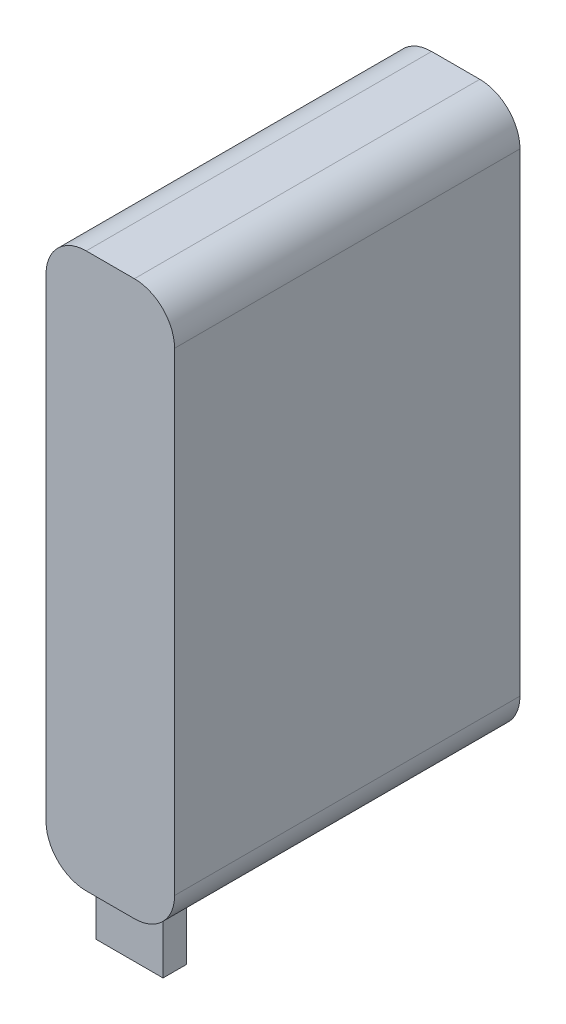
ISO-10303-21;
HEADER;
FILE_DESCRIPTION(('STEP AP214'),'2;1');
FILE_NAME('part.step','',(''),(''),'','','');
FILE_SCHEMA(('AUTOMOTIVE_DESIGN { 1 0 10303 214 1 1 1 1 }'));
ENDSEC;
DATA;
#1=APPLICATION_CONTEXT('core data for automotive mechanical design processes');
#2=APPLICATION_PROTOCOL_DEFINITION('international standard','automotive_design',2000,#1);
#3=PRODUCT_CONTEXT('',#1,'mechanical');
#4=PRODUCT('Part','Part','',(#3));
#5=PRODUCT_RELATED_PRODUCT_CATEGORY('part','',(#4));
#6=PRODUCT_DEFINITION_FORMATION('','',#4);
#7=PRODUCT_DEFINITION_CONTEXT('part definition',#1,'design');
#8=PRODUCT_DEFINITION('design','',#6,#7);
#9=PRODUCT_DEFINITION_SHAPE('','',#8);
#10=(LENGTH_UNIT() NAMED_UNIT(*) SI_UNIT(.MILLI.,.METRE.));
#11=(NAMED_UNIT(*) PLANE_ANGLE_UNIT() SI_UNIT($,.RADIAN.));
#12=(NAMED_UNIT(*) SI_UNIT($,.STERADIAN.) SOLID_ANGLE_UNIT());
#13=UNCERTAINTY_MEASURE_WITH_UNIT(LENGTH_MEASURE(1.E-05),#10,'distance_accuracy_value','');
#14=(GEOMETRIC_REPRESENTATION_CONTEXT(3) GLOBAL_UNCERTAINTY_ASSIGNED_CONTEXT((#13)) GLOBAL_UNIT_ASSIGNED_CONTEXT((#10,
#11,#12)) REPRESENTATION_CONTEXT('',''));
#15=CARTESIAN_POINT('',(0.,0.,0.));
#16=DIRECTION('',(0.,0.,1.));
#17=DIRECTION('',(1.,0.,0.));
#18=AXIS2_PLACEMENT_3D('',#15,#16,#17);
#19=CARTESIAN_POINT('',(-2.99999999999996,-34.5,43.));
#20=DIRECTION('',(0.,1.,0.));
#21=DIRECTION('',(0.,0.,1.));
#22=AXIS2_PLACEMENT_3D('',#19,#20,#21);
#23=PLANE('',#22);
#24=DIRECTION('',(0.,0.,-1.));
#25=VECTOR('',#24,1.);
#26=CARTESIAN_POINT('',(2.99999999999996,-34.5,43.));
#27=LINE('',#26,#25);
#28=CARTESIAN_POINT('',(2.99999999999996,-34.5,37.7090455408714));
#29=VERTEX_POINT('',#28);
#30=CARTESIAN_POINT('',(2.99999999999996,-34.5,0.));
#31=VERTEX_POINT('',#30);
#32=EDGE_CURVE('E168',#29,#31,#27,.T.);
#33=ORIENTED_EDGE('',*,*,#32,.F.);
#34=DIRECTION('',(-1.,0.,0.));
#35=VECTOR('',#34,1.);
#36=CARTESIAN_POINT('',(-2.99999999999996,-34.5,37.7090455408714));
#37=LINE('',#36,#35);
#38=CARTESIAN_POINT('',(-2.99999999999996,-34.5,37.7090455408714));
#39=VERTEX_POINT('',#38);
#40=EDGE_CURVE('E194',#29,#39,#37,.T.);
#41=ORIENTED_EDGE('',*,*,#40,.T.);
#42=DIRECTION('',(0.,0.,-1.));
#43=VECTOR('',#42,1.);
#44=CARTESIAN_POINT('',(-2.99999999999996,-34.5,43.));
#45=LINE('',#44,#43);
#46=CARTESIAN_POINT('',(-2.99999999999996,-34.5,0.));
#47=VERTEX_POINT('',#46);
#48=EDGE_CURVE('E172',#39,#47,#45,.T.);
#49=ORIENTED_EDGE('',*,*,#48,.T.);
#50=DIRECTION('',(1.,0.,0.));
#51=VECTOR('',#50,1.);
#52=CARTESIAN_POINT('',(-2.99999999999996,-34.5,0.));
#53=LINE('',#52,#51);
#54=EDGE_CURVE('E144',#47,#31,#53,.T.);
#55=ORIENTED_EDGE('',*,*,#54,.T.);
#56=EDGE_LOOP('',(#33,#41,#49,#55));
#57=FACE_BOUND('',#56,.T.);
#58=ADVANCED_FACE('F32',(#57),#23,.F.);
#59=CARTESIAN_POINT('',(-2.99999999999999,-29.5,43.));
#60=DIRECTION('',(0.,0.,-1.));
#61=DIRECTION('',(-1.,0.,0.));
#62=AXIS2_PLACEMENT_3D('',#59,#60,#61);
#63=CYLINDRICAL_SURFACE('',#62,5.);
#64=ORIENTED_EDGE('',*,*,#48,.F.);
#65=CARTESIAN_POINT('',(-2.99999999999999,-29.5,37.7090455408714));
#66=DIRECTION('',(0.,0.,-1.));
#67=DIRECTION('',(-1.,0.,0.));
#68=AXIS2_PLACEMENT_3D('',#65,#66,#67);
#69=CIRCLE('',#68,5.);
#70=CARTESIAN_POINT('',(-4.17549652573426,-34.3598567795756,37.7090455408714));
#71=VERTEX_POINT('',#70);
#72=EDGE_CURVE('E145',#39,#71,#69,.T.);
#73=ORIENTED_EDGE('',*,*,#72,.T.);
#74=DIRECTION('',(0.,0.,-1.));
#75=VECTOR('',#74,1.);
#76=CARTESIAN_POINT('',(-4.17549652573426,-34.3598567795756,43.));
#77=LINE('',#76,#75);
#78=CARTESIAN_POINT('',(-4.17549652573426,-34.3598567795756,40.6086959059646));
#79=VERTEX_POINT('',#78);
#80=EDGE_CURVE('E11',#71,#79,#77,.F.);
#81=ORIENTED_EDGE('',*,*,#80,.T.);
#82=CARTESIAN_POINT('',(-2.99999999999999,-29.5,40.6086959059646));
#83=DIRECTION('',(0.,0.,1.));
#84=DIRECTION('',(1.,0.,0.));
#85=AXIS2_PLACEMENT_3D('',#82,#83,#84);
#86=CIRCLE('',#85,5.);
#87=CARTESIAN_POINT('',(-2.99999999999996,-34.5,40.6086959059646));
#88=VERTEX_POINT('',#87);
#89=EDGE_CURVE('E219',#79,#88,#86,.T.);
#90=ORIENTED_EDGE('',*,*,#89,.T.);
#91=CARTESIAN_POINT('',(-2.99999999999996,-34.5,43.));
#92=VERTEX_POINT('',#91);
#93=EDGE_CURVE('E173',#92,#88,#45,.T.);
#94=ORIENTED_EDGE('',*,*,#93,.F.);
#95=CARTESIAN_POINT('',(-2.99999999999999,-29.5,43.));
#96=DIRECTION('',(0.,0.,1.));
#97=DIRECTION('',(1.,0.,0.));
#98=AXIS2_PLACEMENT_3D('',#95,#96,#97);
#99=CIRCLE('',#98,5.);
#100=CARTESIAN_POINT('',(-7.99999999999999,-29.5,43.));
#101=VERTEX_POINT('',#100);
#102=EDGE_CURVE('E158',#101,#92,#99,.T.);
#103=ORIENTED_EDGE('',*,*,#102,.F.);
#104=DIRECTION('',(0.,0.,-1.));
#105=VECTOR('',#104,1.);
#106=CARTESIAN_POINT('',(-7.99999999999999,-29.5,43.));
#107=LINE('',#106,#105);
#108=CARTESIAN_POINT('',(-7.99999999999999,-29.5,0.));
#109=VERTEX_POINT('',#108);
#110=EDGE_CURVE('E137',#101,#109,#107,.T.);
#111=ORIENTED_EDGE('',*,*,#110,.T.);
#112=CARTESIAN_POINT('',(-2.99999999999999,-29.5,0.));
#113=DIRECTION('',(0.,0.,1.));
#114=DIRECTION('',(1.,0.,0.));
#115=AXIS2_PLACEMENT_3D('',#112,#113,#114);
#116=CIRCLE('',#115,5.);
#117=EDGE_CURVE('E141',#109,#47,#116,.T.);
#118=ORIENTED_EDGE('',*,*,#117,.T.);
#119=EDGE_LOOP('',(#64,#73,#81,#90,#94,#103,#111,#118));
#120=FACE_BOUND('',#119,.T.);
#121=ADVANCED_FACE('F34',(#120),#63,.T.);
#122=ORIENTED_EDGE('',*,*,#93,.T.);
#123=DIRECTION('',(1.,0.,0.));
#124=VECTOR('',#123,1.);
#125=CARTESIAN_POINT('',(-2.99999999999996,-34.5,40.6086959059646));
#126=LINE('',#125,#124);
#127=CARTESIAN_POINT('',(2.99999999999996,-34.5,40.6086959059646));
#128=VERTEX_POINT('',#127);
#129=EDGE_CURVE('E222',#88,#128,#126,.T.);
#130=ORIENTED_EDGE('',*,*,#129,.T.);
#131=CARTESIAN_POINT('',(2.99999999999996,-34.5,43.));
#132=VERTEX_POINT('',#131);
#133=EDGE_CURVE('E169',#132,#128,#27,.T.);
#134=ORIENTED_EDGE('',*,*,#133,.F.);
#135=DIRECTION('',(1.,0.,0.));
#136=VECTOR('',#135,1.);
#137=CARTESIAN_POINT('',(-2.99999999999996,-34.5,43.));
#138=LINE('',#137,#136);
#139=EDGE_CURVE('E98',#92,#132,#138,.T.);
#140=ORIENTED_EDGE('',*,*,#139,.F.);
#141=EDGE_LOOP('',(#122,#130,#134,#140));
#142=FACE_BOUND('',#141,.T.);
#143=ADVANCED_FACE('F281',(#142),#23,.F.);
#144=CARTESIAN_POINT('',(3.,-29.5,43.));
#145=DIRECTION('',(0.,0.,-1.));
#146=DIRECTION('',(-1.,0.,0.));
#147=AXIS2_PLACEMENT_3D('',#144,#145,#146);
#148=CYLINDRICAL_SURFACE('',#147,5.);
#149=DIRECTION('',(0.,0.,-1.));
#150=VECTOR('',#149,1.);
#151=CARTESIAN_POINT('',(4.17549652573426,-34.3598567795756,43.));
#152=LINE('',#151,#150);
#153=CARTESIAN_POINT('',(4.17549652573426,-34.3598567795756,40.6086959059646));
#154=VERTEX_POINT('',#153);
#155=CARTESIAN_POINT('',(4.17549652573426,-34.3598567795756,37.7090455408714));
#156=VERTEX_POINT('',#155);
#157=EDGE_CURVE('E178',#154,#156,#152,.T.);
#158=ORIENTED_EDGE('',*,*,#157,.T.);
#159=CARTESIAN_POINT('',(3.,-29.5,37.7090455408714));
#160=DIRECTION('',(0.,0.,-1.));
#161=DIRECTION('',(-1.,0.,0.));
#162=AXIS2_PLACEMENT_3D('',#159,#160,#161);
#163=CIRCLE('',#162,5.);
#164=EDGE_CURVE('E40',#156,#29,#163,.T.);
#165=ORIENTED_EDGE('',*,*,#164,.T.);
#166=ORIENTED_EDGE('',*,*,#32,.T.);
#167=CARTESIAN_POINT('',(3.,-29.5,0.));
#168=DIRECTION('',(0.,0.,1.));
#169=DIRECTION('',(1.,0.,0.));
#170=AXIS2_PLACEMENT_3D('',#167,#168,#169);
#171=CIRCLE('',#170,5.);
#172=CARTESIAN_POINT('',(8.,-29.5,0.));
#173=VERTEX_POINT('',#172);
#174=EDGE_CURVE('E148',#31,#173,#171,.T.);
#175=ORIENTED_EDGE('',*,*,#174,.T.);
#176=DIRECTION('',(0.,0.,-1.));
#177=VECTOR('',#176,1.);
#178=CARTESIAN_POINT('',(8.,-29.5,43.));
#179=LINE('',#178,#177);
#180=CARTESIAN_POINT('',(8.,-29.5,43.));
#181=VERTEX_POINT('',#180);
#182=EDGE_CURVE('E165',#181,#173,#179,.T.);
#183=ORIENTED_EDGE('',*,*,#182,.F.);
#184=CARTESIAN_POINT('',(3.,-29.5,43.));
#185=DIRECTION('',(0.,0.,1.));
#186=DIRECTION('',(1.,0.,0.));
#187=AXIS2_PLACEMENT_3D('',#184,#185,#186);
#188=CIRCLE('',#187,5.);
#189=EDGE_CURVE('E210',#132,#181,#188,.T.);
#190=ORIENTED_EDGE('',*,*,#189,.F.);
#191=ORIENTED_EDGE('',*,*,#133,.T.);
#192=CARTESIAN_POINT('',(3.,-29.5,40.6086959059646));
#193=DIRECTION('',(0.,0.,1.));
#194=DIRECTION('',(1.,0.,0.));
#195=AXIS2_PLACEMENT_3D('',#192,#193,#194);
#196=CIRCLE('',#195,5.);
#197=EDGE_CURVE('E175',#128,#154,#196,.T.);
#198=ORIENTED_EDGE('',*,*,#197,.T.);
#199=EDGE_LOOP('',(#158,#165,#166,#175,#183,#190,#191,#198));
#200=FACE_BOUND('',#199,.T.);
#201=ADVANCED_FACE('F185',(#200),#148,.T.);
#202=CARTESIAN_POINT('',(7.99999999999999,29.5,43.));
#203=DIRECTION('',(-1.,0.,0.));
#204=DIRECTION('',(0.,-1.,0.));
#205=AXIS2_PLACEMENT_3D('',#202,#203,#204);
#206=PLANE('',#205);
#207=DIRECTION('',(0.,1.,0.));
#208=VECTOR('',#207,1.);
#209=CARTESIAN_POINT('',(7.99999999999999,29.5,0.));
#210=LINE('',#209,#208);
#211=CARTESIAN_POINT('',(7.99999999999999,29.5,0.));
#212=VERTEX_POINT('',#211);
#213=EDGE_CURVE('E150',#173,#212,#210,.T.);
#214=ORIENTED_EDGE('',*,*,#213,.T.);
#215=DIRECTION('',(0.,0.,-1.));
#216=VECTOR('',#215,1.);
#217=CARTESIAN_POINT('',(7.99999999999999,29.5,43.));
#218=LINE('',#217,#216);
#219=CARTESIAN_POINT('',(7.99999999999999,29.5,43.));
#220=VERTEX_POINT('',#219);
#221=EDGE_CURVE('E162',#220,#212,#218,.T.);
#222=ORIENTED_EDGE('',*,*,#221,.F.);
#223=DIRECTION('',(0.,1.,0.));
#224=VECTOR('',#223,1.);
#225=CARTESIAN_POINT('',(7.99999999999999,29.5,43.));
#226=LINE('',#225,#224);
#227=EDGE_CURVE('E209',#181,#220,#226,.T.);
#228=ORIENTED_EDGE('',*,*,#227,.F.);
#229=ORIENTED_EDGE('',*,*,#182,.T.);
#230=EDGE_LOOP('',(#214,#222,#228,#229));
#231=FACE_BOUND('',#230,.T.);
#232=ADVANCED_FACE('F207',(#231),#206,.F.);
#233=CARTESIAN_POINT('',(2.99999999999999,29.5,43.));
#234=DIRECTION('',(0.,0.,-1.));
#235=DIRECTION('',(-1.,0.,0.));
#236=AXIS2_PLACEMENT_3D('',#233,#234,#235);
#237=CYLINDRICAL_SURFACE('',#236,5.);
#238=CARTESIAN_POINT('',(2.99999999999999,29.5,0.));
#239=DIRECTION('',(0.,0.,1.));
#240=DIRECTION('',(-1.,0.,0.));
#241=AXIS2_PLACEMENT_3D('',#238,#239,#240);
#242=CIRCLE('',#241,5.);
#243=CARTESIAN_POINT('',(2.99999999999996,34.5,0.));
#244=VERTEX_POINT('',#243);
#245=EDGE_CURVE('E152',#212,#244,#242,.T.);
#246=ORIENTED_EDGE('',*,*,#245,.T.);
#247=DIRECTION('',(0.,0.,-1.));
#248=VECTOR('',#247,1.);
#249=CARTESIAN_POINT('',(2.99999999999996,34.5,43.));
#250=LINE('',#249,#248);
#251=CARTESIAN_POINT('',(2.99999999999996,34.5,43.));
#252=VERTEX_POINT('',#251);
#253=EDGE_CURVE('E132',#252,#244,#250,.T.);
#254=ORIENTED_EDGE('',*,*,#253,.F.);
#255=CARTESIAN_POINT('',(2.99999999999999,29.5,43.));
#256=DIRECTION('',(0.,0.,1.));
#257=DIRECTION('',(-1.,0.,0.));
#258=AXIS2_PLACEMENT_3D('',#255,#256,#257);
#259=CIRCLE('',#258,5.);
#260=EDGE_CURVE('E120',#220,#252,#259,.T.);
#261=ORIENTED_EDGE('',*,*,#260,.F.);
#262=ORIENTED_EDGE('',*,*,#221,.T.);
#263=EDGE_LOOP('',(#246,#254,#261,#262));
#264=FACE_BOUND('',#263,.T.);
#265=ADVANCED_FACE('F305',(#264),#237,.T.);
#266=CARTESIAN_POINT('',(-2.99999999999997,34.5,43.));
#267=DIRECTION('',(0.,-1.,0.));
#268=DIRECTION('',(0.,0.,-1.));
#269=AXIS2_PLACEMENT_3D('',#266,#267,#268);
#270=PLANE('',#269);
#271=DIRECTION('',(-1.,0.,0.));
#272=VECTOR('',#271,1.);
#273=CARTESIAN_POINT('',(-2.99999999999997,34.5,0.));
#274=LINE('',#273,#272);
#275=CARTESIAN_POINT('',(-2.99999999999997,34.5,0.));
#276=VERTEX_POINT('',#275);
#277=EDGE_CURVE('E129',#244,#276,#274,.T.);
#278=ORIENTED_EDGE('',*,*,#277,.T.);
#279=DIRECTION('',(0.,0.,-1.));
#280=VECTOR('',#279,1.);
#281=CARTESIAN_POINT('',(-2.99999999999997,34.5,43.));
#282=LINE('',#281,#280);
#283=CARTESIAN_POINT('',(-2.99999999999997,34.5,43.));
#284=VERTEX_POINT('',#283);
#285=EDGE_CURVE('E126',#284,#276,#282,.T.);
#286=ORIENTED_EDGE('',*,*,#285,.F.);
#287=DIRECTION('',(-1.,0.,0.));
#288=VECTOR('',#287,1.);
#289=CARTESIAN_POINT('',(-2.99999999999997,34.5,43.));
#290=LINE('',#289,#288);
#291=EDGE_CURVE('E113',#252,#284,#290,.T.);
#292=ORIENTED_EDGE('',*,*,#291,.F.);
#293=ORIENTED_EDGE('',*,*,#253,.T.);
#294=EDGE_LOOP('',(#278,#286,#292,#293));
#295=FACE_BOUND('',#294,.T.);
#296=ADVANCED_FACE('F127',(#295),#270,.F.);
#297=CARTESIAN_POINT('',(-3.,29.5,43.));
#298=DIRECTION('',(0.,0.,-1.));
#299=DIRECTION('',(-1.,0.,0.));
#300=AXIS2_PLACEMENT_3D('',#297,#298,#299);
#301=CYLINDRICAL_SURFACE('',#300,5.);
#302=CARTESIAN_POINT('',(-3.,29.5,0.));
#303=DIRECTION('',(0.,0.,1.));
#304=DIRECTION('',(1.,0.,0.));
#305=AXIS2_PLACEMENT_3D('',#302,#303,#304);
#306=CIRCLE('',#305,5.);
#307=CARTESIAN_POINT('',(-8.,29.5,0.));
#308=VERTEX_POINT('',#307);
#309=EDGE_CURVE('E155',#276,#308,#306,.T.);
#310=ORIENTED_EDGE('',*,*,#309,.T.);
#311=DIRECTION('',(0.,0.,-1.));
#312=VECTOR('',#311,1.);
#313=CARTESIAN_POINT('',(-8.,29.5,43.));
#314=LINE('',#313,#312);
#315=CARTESIAN_POINT('',(-8.,29.5,43.));
#316=VERTEX_POINT('',#315);
#317=EDGE_CURVE('E133',#316,#308,#314,.T.);
#318=ORIENTED_EDGE('',*,*,#317,.F.);
#319=CARTESIAN_POINT('',(-3.,29.5,43.));
#320=DIRECTION('',(0.,0.,1.));
#321=DIRECTION('',(1.,0.,0.));
#322=AXIS2_PLACEMENT_3D('',#319,#320,#321);
#323=CIRCLE('',#322,5.);
#324=EDGE_CURVE('E117',#284,#316,#323,.T.);
#325=ORIENTED_EDGE('',*,*,#324,.F.);
#326=ORIENTED_EDGE('',*,*,#285,.T.);
#327=EDGE_LOOP('',(#310,#318,#325,#326));
#328=FACE_BOUND('',#327,.T.);
#329=ADVANCED_FACE('F135',(#328),#301,.T.);
#330=CARTESIAN_POINT('',(-8.,29.5,43.));
#331=DIRECTION('',(1.,0.,0.));
#332=DIRECTION('',(0.,1.,0.));
#333=AXIS2_PLACEMENT_3D('',#330,#331,#332);
#334=PLANE('',#333);
#335=DIRECTION('',(0.,-1.,0.));
#336=VECTOR('',#335,1.);
#337=CARTESIAN_POINT('',(-8.,29.5,0.));
#338=LINE('',#337,#336);
#339=EDGE_CURVE('E89',#308,#109,#338,.T.);
#340=ORIENTED_EDGE('',*,*,#339,.T.);
#341=ORIENTED_EDGE('',*,*,#110,.F.);
#342=DIRECTION('',(0.,-1.,0.));
#343=VECTOR('',#342,1.);
#344=CARTESIAN_POINT('',(-8.,29.5,43.));
#345=LINE('',#344,#343);
#346=EDGE_CURVE('E56',#316,#101,#345,.T.);
#347=ORIENTED_EDGE('',*,*,#346,.F.);
#348=ORIENTED_EDGE('',*,*,#317,.T.);
#349=EDGE_LOOP('',(#340,#341,#347,#348));
#350=FACE_BOUND('',#349,.T.);
#351=ADVANCED_FACE('F279',(#350),#334,.F.);
#352=CARTESIAN_POINT('',(-2.99999999999999,-29.5,43.));
#353=DIRECTION('',(0.,0.,1.));
#354=DIRECTION('',(1.,0.,0.));
#355=AXIS2_PLACEMENT_3D('',#352,#353,#354);
#356=PLANE('',#355);
#357=ORIENTED_EDGE('',*,*,#102,.T.);
#358=ORIENTED_EDGE('',*,*,#139,.T.);
#359=ORIENTED_EDGE('',*,*,#189,.T.);
#360=ORIENTED_EDGE('',*,*,#227,.T.);
#361=ORIENTED_EDGE('',*,*,#260,.T.);
#362=ORIENTED_EDGE('',*,*,#291,.T.);
#363=ORIENTED_EDGE('',*,*,#324,.T.);
#364=ORIENTED_EDGE('',*,*,#346,.T.);
#365=EDGE_LOOP('',(#357,#358,#359,#360,#361,#362,#363,#364));
#366=FACE_BOUND('',#365,.T.);
#367=ADVANCED_FACE('F115',(#366),#356,.T.);
#368=CARTESIAN_POINT('',(-2.99999999999999,-29.5,0.));
#369=DIRECTION('',(0.,0.,1.));
#370=DIRECTION('',(1.,0.,0.));
#371=AXIS2_PLACEMENT_3D('',#368,#369,#370);
#372=PLANE('',#371);
#373=ORIENTED_EDGE('',*,*,#117,.F.);
#374=ORIENTED_EDGE('',*,*,#339,.F.);
#375=ORIENTED_EDGE('',*,*,#309,.F.);
#376=ORIENTED_EDGE('',*,*,#277,.F.);
#377=ORIENTED_EDGE('',*,*,#245,.F.);
#378=ORIENTED_EDGE('',*,*,#213,.F.);
#379=ORIENTED_EDGE('',*,*,#174,.F.);
#380=ORIENTED_EDGE('',*,*,#54,.F.);
#381=EDGE_LOOP('',(#373,#374,#375,#376,#377,#378,#379,#380));
#382=FACE_BOUND('',#381,.T.);
#383=ADVANCED_FACE('F201',(#382),#372,.F.);
#384=CARTESIAN_POINT('',(-4.17549652573426,-24.5,40.6086959059646));
#385=DIRECTION('',(-1.,0.,0.));
#386=DIRECTION('',(0.,0.,1.));
#387=AXIS2_PLACEMENT_3D('',#384,#385,#386);
#388=PLANE('',#387);
#389=ORIENTED_EDGE('',*,*,#80,.F.);
#390=DIRECTION('',(0.,-1.,0.));
#391=VECTOR('',#390,1.);
#392=CARTESIAN_POINT('',(-4.17549652573426,-24.5,37.7090455408714));
#393=LINE('',#392,#391);
#394=CARTESIAN_POINT('',(-4.17549652573426,-41.5,37.7090455408714));
#395=VERTEX_POINT('',#394);
#396=EDGE_CURVE('E231',#71,#395,#393,.T.);
#397=ORIENTED_EDGE('',*,*,#396,.T.);
#398=DIRECTION('',(0.,0.,-1.));
#399=VECTOR('',#398,1.);
#400=CARTESIAN_POINT('',(-4.17549652573426,-41.5,40.6086959059646));
#401=LINE('',#400,#399);
#402=CARTESIAN_POINT('',(-4.17549652573426,-41.5,40.6086959059646));
#403=VERTEX_POINT('',#402);
#404=EDGE_CURVE('E237',#403,#395,#401,.T.);
#405=ORIENTED_EDGE('',*,*,#404,.F.);
#406=DIRECTION('',(0.,-1.,0.));
#407=VECTOR('',#406,1.);
#408=CARTESIAN_POINT('',(-4.17549652573426,-24.5,40.6086959059646));
#409=LINE('',#408,#407);
#410=EDGE_CURVE('E227',#79,#403,#409,.T.);
#411=ORIENTED_EDGE('',*,*,#410,.F.);
#412=EDGE_LOOP('',(#389,#397,#405,#411));
#413=FACE_BOUND('',#412,.T.);
#414=ADVANCED_FACE('F274',(#413),#388,.T.);
#415=CARTESIAN_POINT('',(4.17549652573426,-24.5,40.6086959059646));
#416=DIRECTION('',(1.,0.,0.));
#417=DIRECTION('',(0.,0.,-1.));
#418=AXIS2_PLACEMENT_3D('',#415,#416,#417);
#419=PLANE('',#418);
#420=ORIENTED_EDGE('',*,*,#157,.F.);
#421=DIRECTION('',(0.,-1.,0.));
#422=VECTOR('',#421,1.);
#423=CARTESIAN_POINT('',(4.17549652573426,-24.5,40.6086959059646));
#424=LINE('',#423,#422);
#425=CARTESIAN_POINT('',(4.17549652573426,-41.5,40.6086959059646));
#426=VERTEX_POINT('',#425);
#427=EDGE_CURVE('E47',#154,#426,#424,.T.);
#428=ORIENTED_EDGE('',*,*,#427,.T.);
#429=DIRECTION('',(0.,0.,1.));
#430=VECTOR('',#429,1.);
#431=CARTESIAN_POINT('',(4.17549652573426,-41.5,40.6086959059646));
#432=LINE('',#431,#430);
#433=CARTESIAN_POINT('',(4.17549652573426,-41.5,37.7090455408714));
#434=VERTEX_POINT('',#433);
#435=EDGE_CURVE('E243',#434,#426,#432,.T.);
#436=ORIENTED_EDGE('',*,*,#435,.F.);
#437=DIRECTION('',(0.,-1.,0.));
#438=VECTOR('',#437,1.);
#439=CARTESIAN_POINT('',(4.17549652573426,-24.5,37.7090455408714));
#440=LINE('',#439,#438);
#441=EDGE_CURVE('E225',#156,#434,#440,.T.);
#442=ORIENTED_EDGE('',*,*,#441,.F.);
#443=EDGE_LOOP('',(#420,#428,#436,#442));
#444=FACE_BOUND('',#443,.T.);
#445=ADVANCED_FACE('F255',(#444),#419,.T.);
#446=CARTESIAN_POINT('',(-4.17549652573426,-24.5,37.7090455408714));
#447=DIRECTION('',(0.,0.,-1.));
#448=DIRECTION('',(-1.,0.,0.));
#449=AXIS2_PLACEMENT_3D('',#446,#447,#448);
#450=PLANE('',#449);
#451=ORIENTED_EDGE('',*,*,#72,.F.);
#452=ORIENTED_EDGE('',*,*,#40,.F.);
#453=ORIENTED_EDGE('',*,*,#164,.F.);
#454=ORIENTED_EDGE('',*,*,#441,.T.);
#455=DIRECTION('',(1.,0.,0.));
#456=VECTOR('',#455,1.);
#457=CARTESIAN_POINT('',(-4.17549652573426,-41.5,37.7090455408714));
#458=LINE('',#457,#456);
#459=EDGE_CURVE('E228',#395,#434,#458,.T.);
#460=ORIENTED_EDGE('',*,*,#459,.F.);
#461=ORIENTED_EDGE('',*,*,#396,.F.);
#462=EDGE_LOOP('',(#451,#452,#453,#454,#460,#461));
#463=FACE_BOUND('',#462,.T.);
#464=ADVANCED_FACE('F277',(#463),#450,.T.);
#465=CARTESIAN_POINT('',(-4.17549652573426,-24.5,40.6086959059646));
#466=DIRECTION('',(0.,0.,1.));
#467=DIRECTION('',(1.,0.,0.));
#468=AXIS2_PLACEMENT_3D('',#465,#466,#467);
#469=PLANE('',#468);
#470=ORIENTED_EDGE('',*,*,#89,.F.);
#471=ORIENTED_EDGE('',*,*,#410,.T.);
#472=DIRECTION('',(-1.,0.,0.));
#473=VECTOR('',#472,1.);
#474=CARTESIAN_POINT('',(-4.17549652573426,-41.5,40.6086959059646));
#475=LINE('',#474,#473);
#476=EDGE_CURVE('E240',#426,#403,#475,.T.);
#477=ORIENTED_EDGE('',*,*,#476,.F.);
#478=ORIENTED_EDGE('',*,*,#427,.F.);
#479=ORIENTED_EDGE('',*,*,#197,.F.);
#480=ORIENTED_EDGE('',*,*,#129,.F.);
#481=EDGE_LOOP('',(#470,#471,#477,#478,#479,#480));
#482=FACE_BOUND('',#481,.T.);
#483=ADVANCED_FACE('F282',(#482),#469,.T.);
#484=CARTESIAN_POINT('',(0.,-41.5,0.));
#485=DIRECTION('',(0.,-1.,0.));
#486=DIRECTION('',(0.,0.,-1.));
#487=AXIS2_PLACEMENT_3D('',#484,#485,#486);
#488=PLANE('',#487);
#489=ORIENTED_EDGE('',*,*,#435,.T.);
#490=ORIENTED_EDGE('',*,*,#476,.T.);
#491=ORIENTED_EDGE('',*,*,#404,.T.);
#492=ORIENTED_EDGE('',*,*,#459,.T.);
#493=EDGE_LOOP('',(#489,#490,#491,#492));
#494=FACE_BOUND('',#493,.T.);
#495=ADVANCED_FACE('F248',(#494),#488,.T.);
#496=CLOSED_SHELL('',(#58,#121,#143,#201,#232,#265,#296,#329,#351,#367,#383,#414,#445,#464,#483,#495));
#497=MANIFOLD_SOLID_BREP('B2',#496);
#498=ADVANCED_BREP_SHAPE_REPRESENTATION('',(#18,#497),#14);
#499=SHAPE_DEFINITION_REPRESENTATION(#9,#498);
ENDSEC;
END-ISO-10303-21;
